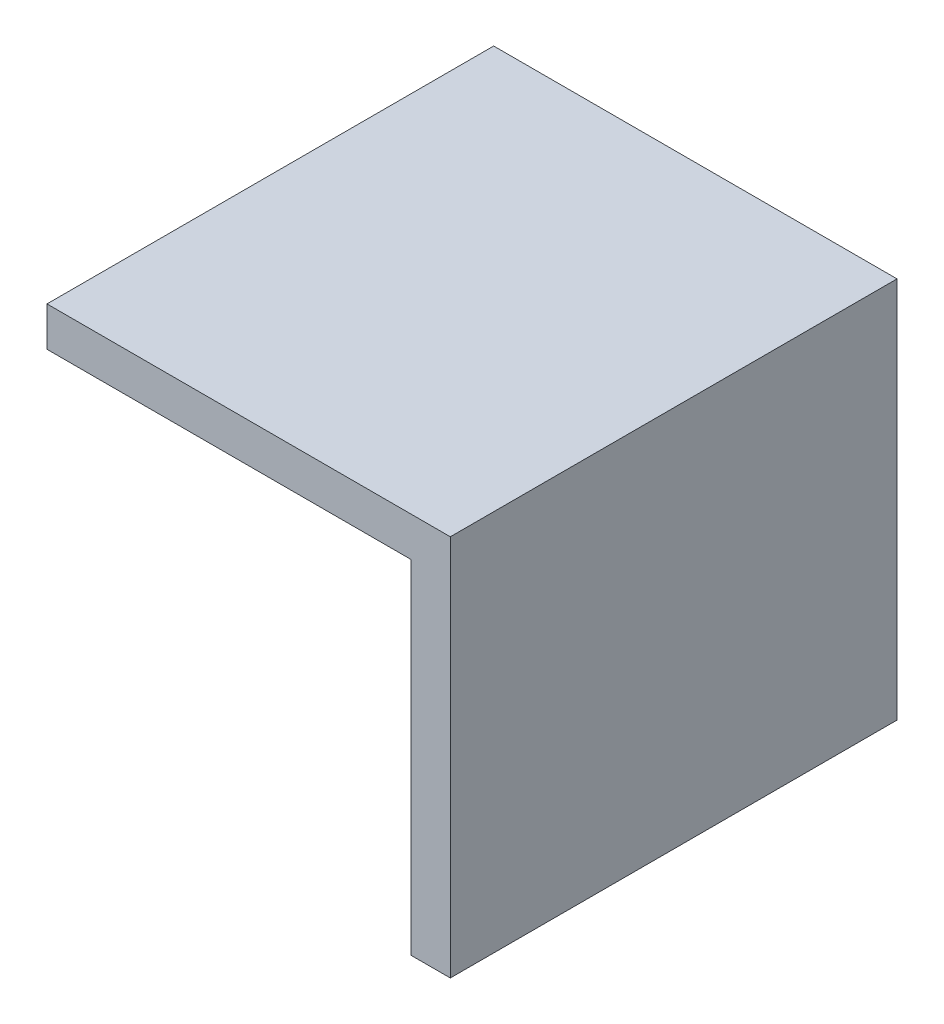
ISO-10303-21;
HEADER;
FILE_DESCRIPTION(('STEP AP214'),'2;1');
FILE_NAME('part.step','',(''),(''),'','','');
FILE_SCHEMA(('AUTOMOTIVE_DESIGN { 1 0 10303 214 1 1 1 1 }'));
ENDSEC;
DATA;
#1=APPLICATION_CONTEXT('core data for automotive mechanical design processes');
#2=APPLICATION_PROTOCOL_DEFINITION('international standard','automotive_design',2000,#1);
#3=PRODUCT_CONTEXT('',#1,'mechanical');
#4=PRODUCT('Part','Part','',(#3));
#5=PRODUCT_RELATED_PRODUCT_CATEGORY('part','',(#4));
#6=PRODUCT_DEFINITION_FORMATION('','',#4);
#7=PRODUCT_DEFINITION_CONTEXT('part definition',#1,'design');
#8=PRODUCT_DEFINITION('design','',#6,#7);
#9=PRODUCT_DEFINITION_SHAPE('','',#8);
#10=(LENGTH_UNIT() NAMED_UNIT(*) SI_UNIT(.MILLI.,.METRE.));
#11=(NAMED_UNIT(*) PLANE_ANGLE_UNIT() SI_UNIT($,.RADIAN.));
#12=(NAMED_UNIT(*) SI_UNIT($,.STERADIAN.) SOLID_ANGLE_UNIT());
#13=UNCERTAINTY_MEASURE_WITH_UNIT(LENGTH_MEASURE(1.E-05),#10,'distance_accuracy_value','');
#14=(GEOMETRIC_REPRESENTATION_CONTEXT(3) GLOBAL_UNCERTAINTY_ASSIGNED_CONTEXT((#13)) GLOBAL_UNIT_ASSIGNED_CONTEXT((#10,
#11,#12)) REPRESENTATION_CONTEXT('',''));
#15=CARTESIAN_POINT('',(0.,0.,0.));
#16=DIRECTION('',(0.,0.,1.));
#17=DIRECTION('',(1.,0.,0.));
#18=AXIS2_PLACEMENT_3D('',#15,#16,#17);
#19=CARTESIAN_POINT('',(0.,3.9,0.));
#20=DIRECTION('',(1.,0.,0.));
#21=DIRECTION('',(0.,0.,-1.));
#22=AXIS2_PLACEMENT_3D('',#19,#20,#21);
#23=PLANE('',#22);
#24=DIRECTION('',(0.,0.,1.));
#25=VECTOR('',#24,1.);
#26=CARTESIAN_POINT('',(0.,0.,0.));
#27=LINE('',#26,#25);
#28=CARTESIAN_POINT('',(0.,0.,-44.3));
#29=VERTEX_POINT('',#28);
#30=CARTESIAN_POINT('',(0.,0.,0.));
#31=VERTEX_POINT('',#30);
#32=EDGE_CURVE('E127',#29,#31,#27,.T.);
#33=ORIENTED_EDGE('',*,*,#32,.T.);
#34=DIRECTION('',(0.,-1.,0.));
#35=VECTOR('',#34,1.);
#36=CARTESIAN_POINT('',(0.,3.9,0.));
#37=LINE('',#36,#35);
#38=CARTESIAN_POINT('',(0.,3.9,0.));
#39=VERTEX_POINT('',#38);
#40=EDGE_CURVE('E11',#39,#31,#37,.T.);
#41=ORIENTED_EDGE('',*,*,#40,.F.);
#42=DIRECTION('',(0.,0.,1.));
#43=VECTOR('',#42,1.);
#44=CARTESIAN_POINT('',(0.,3.9,0.));
#45=LINE('',#44,#43);
#46=CARTESIAN_POINT('',(0.,3.9,-44.3));
#47=VERTEX_POINT('',#46);
#48=EDGE_CURVE('E136',#47,#39,#45,.T.);
#49=ORIENTED_EDGE('',*,*,#48,.F.);
#50=DIRECTION('',(0.,-1.,0.));
#51=VECTOR('',#50,1.);
#52=CARTESIAN_POINT('',(0.,3.9,-44.3));
#53=LINE('',#52,#51);
#54=EDGE_CURVE('E145',#47,#29,#53,.T.);
#55=ORIENTED_EDGE('',*,*,#54,.T.);
#56=EDGE_LOOP('',(#33,#41,#49,#55));
#57=FACE_BOUND('',#56,.T.);
#58=ADVANCED_FACE('F43',(#57),#23,.F.);
#59=CARTESIAN_POINT('',(0.,3.9,0.));
#60=DIRECTION('',(0.,0.,-1.));
#61=DIRECTION('',(-1.,0.,0.));
#62=AXIS2_PLACEMENT_3D('',#59,#60,#61);
#63=PLANE('',#62);
#64=DIRECTION('',(1.,0.,0.));
#65=VECTOR('',#64,1.);
#66=CARTESIAN_POINT('',(0.,0.,0.));
#67=LINE('',#66,#65);
#68=CARTESIAN_POINT('',(36.1,0.,0.));
#69=VERTEX_POINT('',#68);
#70=EDGE_CURVE('E125',#31,#69,#67,.T.);
#71=ORIENTED_EDGE('',*,*,#70,.T.);
#72=DIRECTION('',(0.,1.,0.));
#73=VECTOR('',#72,1.);
#74=CARTESIAN_POINT('',(36.1,-33.996,0.));
#75=LINE('',#74,#73);
#76=CARTESIAN_POINT('',(36.1,-33.996,0.));
#77=VERTEX_POINT('',#76);
#78=EDGE_CURVE('E108',#77,#69,#75,.T.);
#79=ORIENTED_EDGE('',*,*,#78,.F.);
#80=DIRECTION('',(-1.,0.,0.));
#81=VECTOR('',#80,1.);
#82=CARTESIAN_POINT('',(40.,-33.996,0.));
#83=LINE('',#82,#81);
#84=CARTESIAN_POINT('',(40.,-33.996,0.));
#85=VERTEX_POINT('',#84);
#86=EDGE_CURVE('E115',#85,#77,#83,.T.);
#87=ORIENTED_EDGE('',*,*,#86,.F.);
#88=DIRECTION('',(0.,-1.,0.));
#89=VECTOR('',#88,1.);
#90=CARTESIAN_POINT('',(40.,3.9,0.));
#91=LINE('',#90,#89);
#92=CARTESIAN_POINT('',(40.,3.9,0.));
#93=VERTEX_POINT('',#92);
#94=EDGE_CURVE('E51',#93,#85,#91,.T.);
#95=ORIENTED_EDGE('',*,*,#94,.F.);
#96=DIRECTION('',(1.,0.,0.));
#97=VECTOR('',#96,1.);
#98=CARTESIAN_POINT('',(0.,3.9,0.));
#99=LINE('',#98,#97);
#100=EDGE_CURVE('E87',#39,#93,#99,.T.);
#101=ORIENTED_EDGE('',*,*,#100,.F.);
#102=ORIENTED_EDGE('',*,*,#40,.T.);
#103=EDGE_LOOP('',(#71,#79,#87,#95,#101,#102));
#104=FACE_BOUND('',#103,.T.);
#105=ADVANCED_FACE('F124',(#104),#63,.F.);
#106=CARTESIAN_POINT('',(40.,3.9,0.));
#107=DIRECTION('',(-1.,0.,0.));
#108=DIRECTION('',(0.,0.,1.));
#109=AXIS2_PLACEMENT_3D('',#106,#107,#108);
#110=PLANE('',#109);
#111=ORIENTED_EDGE('',*,*,#94,.T.);
#112=DIRECTION('',(0.,0.,-1.));
#113=VECTOR('',#112,1.);
#114=CARTESIAN_POINT('',(40.,-33.996,0.));
#115=LINE('',#114,#113);
#116=CARTESIAN_POINT('',(40.,-33.996,-44.3));
#117=VERTEX_POINT('',#116);
#118=EDGE_CURVE('E121',#85,#117,#115,.T.);
#119=ORIENTED_EDGE('',*,*,#118,.T.);
#120=DIRECTION('',(0.,-1.,0.));
#121=VECTOR('',#120,1.);
#122=CARTESIAN_POINT('',(40.,3.9,-44.3));
#123=LINE('',#122,#121);
#124=CARTESIAN_POINT('',(40.,3.9,-44.3));
#125=VERTEX_POINT('',#124);
#126=EDGE_CURVE('E153',#125,#117,#123,.T.);
#127=ORIENTED_EDGE('',*,*,#126,.F.);
#128=DIRECTION('',(0.,0.,-1.));
#129=VECTOR('',#128,1.);
#130=CARTESIAN_POINT('',(40.,3.9,0.));
#131=LINE('',#130,#129);
#132=EDGE_CURVE('E141',#93,#125,#131,.T.);
#133=ORIENTED_EDGE('',*,*,#132,.F.);
#134=EDGE_LOOP('',(#111,#119,#127,#133));
#135=FACE_BOUND('',#134,.T.);
#136=ADVANCED_FACE('F158',(#135),#110,.F.);
#137=CARTESIAN_POINT('',(0.,3.9,-44.3));
#138=DIRECTION('',(0.,0.,1.));
#139=DIRECTION('',(1.,0.,0.));
#140=AXIS2_PLACEMENT_3D('',#137,#138,#139);
#141=PLANE('',#140);
#142=ORIENTED_EDGE('',*,*,#126,.T.);
#143=DIRECTION('',(-1.,0.,0.));
#144=VECTOR('',#143,1.);
#145=CARTESIAN_POINT('',(40.,-33.996,-44.3));
#146=LINE('',#145,#144);
#147=CARTESIAN_POINT('',(36.1,-33.996,-44.3));
#148=VERTEX_POINT('',#147);
#149=EDGE_CURVE('E114',#117,#148,#146,.T.);
#150=ORIENTED_EDGE('',*,*,#149,.T.);
#151=DIRECTION('',(0.,1.,0.));
#152=VECTOR('',#151,1.);
#153=CARTESIAN_POINT('',(36.1,-33.996,-44.3));
#154=LINE('',#153,#152);
#155=CARTESIAN_POINT('',(36.1,0.,-44.3));
#156=VERTEX_POINT('',#155);
#157=EDGE_CURVE('E109',#148,#156,#154,.T.);
#158=ORIENTED_EDGE('',*,*,#157,.T.);
#159=DIRECTION('',(-1.,0.,0.));
#160=VECTOR('',#159,1.);
#161=CARTESIAN_POINT('',(0.,0.,-44.3));
#162=LINE('',#161,#160);
#163=EDGE_CURVE('E80',#156,#29,#162,.T.);
#164=ORIENTED_EDGE('',*,*,#163,.T.);
#165=ORIENTED_EDGE('',*,*,#54,.F.);
#166=DIRECTION('',(-1.,0.,0.));
#167=VECTOR('',#166,1.);
#168=CARTESIAN_POINT('',(0.,3.9,-44.3));
#169=LINE('',#168,#167);
#170=EDGE_CURVE('E67',#125,#47,#169,.T.);
#171=ORIENTED_EDGE('',*,*,#170,.F.);
#172=EDGE_LOOP('',(#142,#150,#158,#164,#165,#171));
#173=FACE_BOUND('',#172,.T.);
#174=ADVANCED_FACE('F166',(#173),#141,.F.);
#175=CARTESIAN_POINT('',(0.,3.9,0.));
#176=DIRECTION('',(0.,-1.,0.));
#177=DIRECTION('',(0.,0.,-1.));
#178=AXIS2_PLACEMENT_3D('',#175,#176,#177);
#179=PLANE('',#178);
#180=ORIENTED_EDGE('',*,*,#48,.T.);
#181=ORIENTED_EDGE('',*,*,#100,.T.);
#182=ORIENTED_EDGE('',*,*,#132,.T.);
#183=ORIENTED_EDGE('',*,*,#170,.T.);
#184=EDGE_LOOP('',(#180,#181,#182,#183));
#185=FACE_BOUND('',#184,.T.);
#186=ADVANCED_FACE('F160',(#185),#179,.F.);
#187=CARTESIAN_POINT('',(0.,0.,0.));
#188=DIRECTION('',(0.,-1.,0.));
#189=DIRECTION('',(0.,0.,-1.));
#190=AXIS2_PLACEMENT_3D('',#187,#188,#189);
#191=PLANE('',#190);
#192=DIRECTION('',(0.,0.,-1.));
#193=VECTOR('',#192,1.);
#194=CARTESIAN_POINT('',(36.1,0.,0.));
#195=LINE('',#194,#193);
#196=EDGE_CURVE('E58',#69,#156,#195,.T.);
#197=ORIENTED_EDGE('',*,*,#196,.F.);
#198=ORIENTED_EDGE('',*,*,#70,.F.);
#199=ORIENTED_EDGE('',*,*,#32,.F.);
#200=ORIENTED_EDGE('',*,*,#163,.F.);
#201=EDGE_LOOP('',(#197,#198,#199,#200));
#202=FACE_BOUND('',#201,.T.);
#203=ADVANCED_FACE('F165',(#202),#191,.T.);
#204=CARTESIAN_POINT('',(36.1,-33.996,0.));
#205=DIRECTION('',(1.,0.,0.));
#206=DIRECTION('',(0.,0.,-1.));
#207=AXIS2_PLACEMENT_3D('',#204,#205,#206);
#208=PLANE('',#207);
#209=ORIENTED_EDGE('',*,*,#196,.T.);
#210=ORIENTED_EDGE('',*,*,#157,.F.);
#211=DIRECTION('',(0.,0.,-1.));
#212=VECTOR('',#211,1.);
#213=CARTESIAN_POINT('',(36.1,-33.996,0.));
#214=LINE('',#213,#212);
#215=EDGE_CURVE('E104',#77,#148,#214,.T.);
#216=ORIENTED_EDGE('',*,*,#215,.F.);
#217=ORIENTED_EDGE('',*,*,#78,.T.);
#218=EDGE_LOOP('',(#209,#210,#216,#217));
#219=FACE_BOUND('',#218,.T.);
#220=ADVANCED_FACE('F106',(#219),#208,.F.);
#221=CARTESIAN_POINT('',(0.,-33.996,0.));
#222=DIRECTION('',(0.,-1.,0.));
#223=DIRECTION('',(0.,0.,-1.));
#224=AXIS2_PLACEMENT_3D('',#221,#222,#223);
#225=PLANE('',#224);
#226=ORIENTED_EDGE('',*,*,#86,.T.);
#227=ORIENTED_EDGE('',*,*,#215,.T.);
#228=ORIENTED_EDGE('',*,*,#149,.F.);
#229=ORIENTED_EDGE('',*,*,#118,.F.);
#230=EDGE_LOOP('',(#226,#227,#228,#229));
#231=FACE_BOUND('',#230,.T.);
#232=ADVANCED_FACE('F119',(#231),#225,.T.);
#233=CLOSED_SHELL('',(#58,#105,#136,#174,#186,#203,#220,#232));
#234=MANIFOLD_SOLID_BREP('B2',#233);
#235=ADVANCED_BREP_SHAPE_REPRESENTATION('',(#18,#234),#14);
#236=SHAPE_DEFINITION_REPRESENTATION(#9,#235);
ENDSEC;
END-ISO-10303-21;
